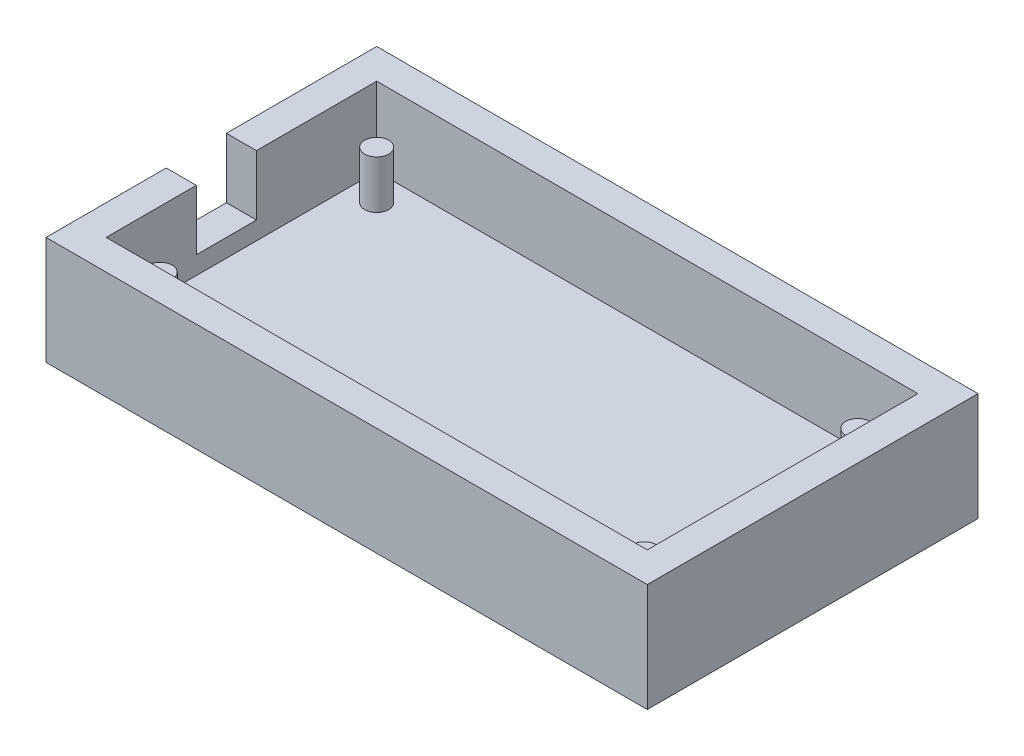
ISO-10303-21;
HEADER;
FILE_DESCRIPTION(('STEP AP214'),'2;1');
FILE_NAME('part.step','',(''),(''),'','','');
FILE_SCHEMA(('AUTOMOTIVE_DESIGN { 1 0 10303 214 1 1 1 1 }'));
ENDSEC;
DATA;
#1=APPLICATION_CONTEXT('core data for automotive mechanical design processes');
#2=APPLICATION_PROTOCOL_DEFINITION('international standard','automotive_design',2000,#1);
#3=PRODUCT_CONTEXT('',#1,'mechanical');
#4=PRODUCT('Part','Part','',(#3));
#5=PRODUCT_RELATED_PRODUCT_CATEGORY('part','',(#4));
#6=PRODUCT_DEFINITION_FORMATION('','',#4);
#7=PRODUCT_DEFINITION_CONTEXT('part definition',#1,'design');
#8=PRODUCT_DEFINITION('design','',#6,#7);
#9=PRODUCT_DEFINITION_SHAPE('','',#8);
#10=(LENGTH_UNIT() NAMED_UNIT(*) SI_UNIT(.MILLI.,.METRE.));
#11=(NAMED_UNIT(*) PLANE_ANGLE_UNIT() SI_UNIT($,.RADIAN.));
#12=(NAMED_UNIT(*) SI_UNIT($,.STERADIAN.) SOLID_ANGLE_UNIT());
#13=UNCERTAINTY_MEASURE_WITH_UNIT(LENGTH_MEASURE(1.E-05),#10,'distance_accuracy_value','');
#14=(GEOMETRIC_REPRESENTATION_CONTEXT(3) GLOBAL_UNCERTAINTY_ASSIGNED_CONTEXT((#13)) GLOBAL_UNIT_ASSIGNED_CONTEXT((#10,
#11,#12)) REPRESENTATION_CONTEXT('',''));
#15=CARTESIAN_POINT('',(0.,0.,0.));
#16=DIRECTION('',(0.,0.,1.));
#17=DIRECTION('',(1.,0.,0.));
#18=AXIS2_PLACEMENT_3D('',#15,#16,#17);
#19=CARTESIAN_POINT('',(0.,0.,0.));
#20=DIRECTION('',(0.,1.,0.));
#21=DIRECTION('',(0.,0.,1.));
#22=AXIS2_PLACEMENT_3D('',#19,#20,#21);
#23=PLANE('',#22);
#24=CARTESIAN_POINT('',(71.5420227764967,0.,-32.3069578450724));
#25=DIRECTION('',(0.,1.,0.));
#26=DIRECTION('',(0.,0.,1.));
#27=AXIS2_PLACEMENT_3D('',#24,#25,#26);
#28=CIRCLE('',#27,2.);
#29=CARTESIAN_POINT('',(71.5420227764967,0.,-30.3069578450724));
#30=VERTEX_POINT('',#29);
#31=EDGE_CURVE('E272',#30,#30,#28,.T.);
#32=ORIENTED_EDGE('',*,*,#31,.F.);
#33=EDGE_LOOP('',(#32));
#34=FACE_BOUND('',#33,.T.);
#35=CARTESIAN_POINT('',(71.5420227764967,0.,3.19304215492761));
#36=DIRECTION('',(0.,1.,0.));
#37=DIRECTION('',(0.,0.,1.));
#38=AXIS2_PLACEMENT_3D('',#35,#36,#37);
#39=CIRCLE('',#38,2.);
#40=CARTESIAN_POINT('',(71.5420227764967,0.,5.19304215492761));
#41=VERTEX_POINT('',#40);
#42=EDGE_CURVE('E266',#41,#41,#39,.T.);
#43=ORIENTED_EDGE('',*,*,#42,.F.);
#44=EDGE_LOOP('',(#43));
#45=FACE_BOUND('',#44,.T.);
#46=CARTESIAN_POINT('',(-8.95797722350329,0.,3.19304215492761));
#47=DIRECTION('',(0.,1.,0.));
#48=DIRECTION('',(0.,0.,1.));
#49=AXIS2_PLACEMENT_3D('',#46,#47,#48);
#50=CIRCLE('',#49,2.);
#51=CARTESIAN_POINT('',(-8.95797722350329,0.,5.19304215492761));
#52=VERTEX_POINT('',#51);
#53=EDGE_CURVE('E260',#52,#52,#50,.T.);
#54=ORIENTED_EDGE('',*,*,#53,.F.);
#55=EDGE_LOOP('',(#54));
#56=FACE_BOUND('',#55,.T.);
#57=CARTESIAN_POINT('',(-8.95797722350329,0.,-32.8069578450724));
#58=DIRECTION('',(0.,1.,0.));
#59=DIRECTION('',(0.,0.,1.));
#60=AXIS2_PLACEMENT_3D('',#57,#58,#59);
#61=CIRCLE('',#60,2.);
#62=CARTESIAN_POINT('',(-8.95797722350329,0.,-30.8069578450724));
#63=VERTEX_POINT('',#62);
#64=EDGE_CURVE('E254',#63,#63,#61,.T.);
#65=ORIENTED_EDGE('',*,*,#64,.F.);
#66=EDGE_LOOP('',(#65));
#67=FACE_BOUND('',#66,.T.);
#68=DIRECTION('',(0.,0.,-1.));
#69=VECTOR('',#68,1.);
#70=CARTESIAN_POINT('',(-13.4579772235033,0.,0.));
#71=LINE('',#70,#69);
#72=CARTESIAN_POINT('',(-13.4579772235033,0.,7.69304215492762));
#73=VERTEX_POINT('',#72);
#74=CARTESIAN_POINT('',(-13.4579772235033,0.,-37.3069578450724));
#75=VERTEX_POINT('',#74);
#76=EDGE_CURVE('E177',#73,#75,#71,.T.);
#77=ORIENTED_EDGE('',*,*,#76,.F.);
#78=DIRECTION('',(-1.,0.,0.));
#79=VECTOR('',#78,1.);
#80=CARTESIAN_POINT('',(0.,0.,7.69304215492762));
#81=LINE('',#80,#79);
#82=CARTESIAN_POINT('',(76.5420227764967,0.,7.69304215492761));
#83=VERTEX_POINT('',#82);
#84=EDGE_CURVE('E149',#83,#73,#81,.T.);
#85=ORIENTED_EDGE('',*,*,#84,.F.);
#86=DIRECTION('',(0.,0.,-1.));
#87=VECTOR('',#86,1.);
#88=CARTESIAN_POINT('',(76.5420227764967,0.,0.));
#89=LINE('',#88,#87);
#90=CARTESIAN_POINT('',(76.5420227764967,0.,-37.3069578450724));
#91=VERTEX_POINT('',#90);
#92=EDGE_CURVE('E152',#83,#91,#89,.T.);
#93=ORIENTED_EDGE('',*,*,#92,.T.);
#94=DIRECTION('',(-1.,0.,0.));
#95=VECTOR('',#94,1.);
#96=CARTESIAN_POINT('',(0.,0.,-37.3069578450724));
#97=LINE('',#96,#95);
#98=EDGE_CURVE('E180',#91,#75,#97,.T.);
#99=ORIENTED_EDGE('',*,*,#98,.T.);
#100=EDGE_LOOP('',(#77,#85,#93,#99));
#101=FACE_BOUND('',#100,.T.);
#102=ADVANCED_FACE('F38',(#34,#45,#56,#67,#101),#23,.T.);
#103=CARTESIAN_POINT('',(-18.4579772235033,-4.99999999999999,-42.3069578450724));
#104=DIRECTION('',(-1.,0.,0.));
#105=DIRECTION('',(0.,0.,1.));
#106=AXIS2_PLACEMENT_3D('',#103,#104,#105);
#107=PLANE('',#106);
#108=DIRECTION('',(0.,-1.,0.));
#109=VECTOR('',#108,1.);
#110=CARTESIAN_POINT('',(-18.4579772235033,13.,-7.30695784507238));
#111=LINE('',#110,#109);
#112=CARTESIAN_POINT('',(-18.4579772235033,13.,-7.30695784507238));
#113=VERTEX_POINT('',#112);
#114=CARTESIAN_POINT('',(-18.4579772235033,3.,-7.30695784507238));
#115=VERTEX_POINT('',#114);
#116=EDGE_CURVE('E127',#113,#115,#111,.T.);
#117=ORIENTED_EDGE('',*,*,#116,.T.);
#118=DIRECTION('',(0.,0.,1.));
#119=VECTOR('',#118,1.);
#120=CARTESIAN_POINT('',(-18.4579772235033,3.,0.));
#121=LINE('',#120,#119);
#122=CARTESIAN_POINT('',(-18.4579772235033,3.,-17.3069578450724));
#123=VERTEX_POINT('',#122);
#124=EDGE_CURVE('E225',#123,#115,#121,.T.);
#125=ORIENTED_EDGE('',*,*,#124,.F.);
#126=DIRECTION('',(0.,-1.,0.));
#127=VECTOR('',#126,1.);
#128=CARTESIAN_POINT('',(-18.4579772235033,13.,-17.3069578450724));
#129=LINE('',#128,#127);
#130=CARTESIAN_POINT('',(-18.4579772235033,13.,-17.3069578450724));
#131=VERTEX_POINT('',#130);
#132=EDGE_CURVE('E63',#131,#123,#129,.T.);
#133=ORIENTED_EDGE('',*,*,#132,.F.);
#134=DIRECTION('',(0.,0.,1.));
#135=VECTOR('',#134,1.);
#136=CARTESIAN_POINT('',(-18.4579772235033,13.,0.));
#137=LINE('',#136,#135);
#138=CARTESIAN_POINT('',(-18.4579772235033,13.,-42.3069578450724));
#139=VERTEX_POINT('',#138);
#140=EDGE_CURVE('E144',#139,#131,#137,.T.);
#141=ORIENTED_EDGE('',*,*,#140,.F.);
#142=DIRECTION('',(0.,1.,0.));
#143=VECTOR('',#142,1.);
#144=CARTESIAN_POINT('',(-18.4579772235033,-4.99999999999999,-42.3069578450724));
#145=LINE('',#144,#143);
#146=CARTESIAN_POINT('',(-18.4579772235033,-4.99999999999999,-42.3069578450724));
#147=VERTEX_POINT('',#146);
#148=EDGE_CURVE('E11',#147,#139,#145,.T.);
#149=ORIENTED_EDGE('',*,*,#148,.F.);
#150=DIRECTION('',(0.,0.,1.));
#151=VECTOR('',#150,1.);
#152=CARTESIAN_POINT('',(-18.4579772235033,-4.99999999999999,-42.3069578450724));
#153=LINE('',#152,#151);
#154=CARTESIAN_POINT('',(-18.4579772235033,-4.99999999999999,12.6930421369276));
#155=VERTEX_POINT('',#154);
#156=EDGE_CURVE('E134',#147,#155,#153,.T.);
#157=ORIENTED_EDGE('',*,*,#156,.T.);
#158=DIRECTION('',(0.,1.,0.));
#159=VECTOR('',#158,1.);
#160=CARTESIAN_POINT('',(-18.4579772235033,-4.99999999999999,12.6930421369276));
#161=LINE('',#160,#159);
#162=CARTESIAN_POINT('',(-18.4579772235033,13.,12.6930421369276));
#163=VERTEX_POINT('',#162);
#164=EDGE_CURVE('E42',#155,#163,#161,.T.);
#165=ORIENTED_EDGE('',*,*,#164,.T.);
#166=EDGE_CURVE('E137',#113,#163,#137,.T.);
#167=ORIENTED_EDGE('',*,*,#166,.F.);
#168=EDGE_LOOP('',(#117,#125,#133,#141,#149,#157,#165,#167));
#169=FACE_BOUND('',#168,.T.);
#170=ADVANCED_FACE('F40',(#169),#107,.T.);
#171=CARTESIAN_POINT('',(-18.4579772235033,-4.99999999999999,-42.3069578450724));
#172=DIRECTION('',(0.,0.,-1.));
#173=DIRECTION('',(-1.,0.,0.));
#174=AXIS2_PLACEMENT_3D('',#171,#172,#173);
#175=PLANE('',#174);
#176=ORIENTED_EDGE('',*,*,#148,.T.);
#177=DIRECTION('',(-1.,0.,0.));
#178=VECTOR('',#177,1.);
#179=CARTESIAN_POINT('',(0.,13.,-42.3069578450724));
#180=LINE('',#179,#178);
#181=CARTESIAN_POINT('',(81.5420226744967,13.,-42.3069578450724));
#182=VERTEX_POINT('',#181);
#183=EDGE_CURVE('E162',#182,#139,#180,.T.);
#184=ORIENTED_EDGE('',*,*,#183,.F.);
#185=DIRECTION('',(0.,1.,0.));
#186=VECTOR('',#185,1.);
#187=CARTESIAN_POINT('',(81.5420226744967,-4.99999999999999,-42.3069578450724));
#188=LINE('',#187,#186);
#189=CARTESIAN_POINT('',(81.5420226744967,-4.99999999999999,-42.3069578450724));
#190=VERTEX_POINT('',#189);
#191=EDGE_CURVE('E47',#190,#182,#188,.T.);
#192=ORIENTED_EDGE('',*,*,#191,.F.);
#193=DIRECTION('',(-1.,0.,0.));
#194=VECTOR('',#193,1.);
#195=CARTESIAN_POINT('',(-18.4579772235033,-4.99999999999999,-42.3069578450724));
#196=LINE('',#195,#194);
#197=EDGE_CURVE('E208',#190,#147,#196,.T.);
#198=ORIENTED_EDGE('',*,*,#197,.T.);
#199=EDGE_LOOP('',(#176,#184,#192,#198));
#200=FACE_BOUND('',#199,.T.);
#201=ADVANCED_FACE('F222',(#200),#175,.T.);
#202=CARTESIAN_POINT('',(81.5420226744967,-4.99999999999999,-42.3069578450724));
#203=DIRECTION('',(1.,0.,0.));
#204=DIRECTION('',(0.,0.,-1.));
#205=AXIS2_PLACEMENT_3D('',#202,#203,#204);
#206=PLANE('',#205);
#207=ORIENTED_EDGE('',*,*,#191,.T.);
#208=DIRECTION('',(0.,0.,-1.));
#209=VECTOR('',#208,1.);
#210=CARTESIAN_POINT('',(81.5420226744967,13.,0.));
#211=LINE('',#210,#209);
#212=CARTESIAN_POINT('',(81.5420226744967,13.,12.6930421369276));
#213=VERTEX_POINT('',#212);
#214=EDGE_CURVE('E159',#213,#182,#211,.T.);
#215=ORIENTED_EDGE('',*,*,#214,.F.);
#216=DIRECTION('',(0.,1.,0.));
#217=VECTOR('',#216,1.);
#218=CARTESIAN_POINT('',(81.5420226744967,-4.99999999999999,12.6930421369276));
#219=LINE('',#218,#217);
#220=CARTESIAN_POINT('',(81.5420226744967,-4.99999999999999,12.6930421369276));
#221=VERTEX_POINT('',#220);
#222=EDGE_CURVE('E211',#221,#213,#219,.T.);
#223=ORIENTED_EDGE('',*,*,#222,.F.);
#224=DIRECTION('',(0.,0.,-1.));
#225=VECTOR('',#224,1.);
#226=CARTESIAN_POINT('',(81.5420226744967,-4.99999999999999,-42.3069578450724));
#227=LINE('',#226,#225);
#228=EDGE_CURVE('E205',#221,#190,#227,.T.);
#229=ORIENTED_EDGE('',*,*,#228,.T.);
#230=EDGE_LOOP('',(#207,#215,#223,#229));
#231=FACE_BOUND('',#230,.T.);
#232=ADVANCED_FACE('F219',(#231),#206,.T.);
#233=CARTESIAN_POINT('',(-18.4579772235033,-4.99999999999999,12.6930421369276));
#234=DIRECTION('',(0.,0.,1.));
#235=DIRECTION('',(1.,0.,0.));
#236=AXIS2_PLACEMENT_3D('',#233,#234,#235);
#237=PLANE('',#236);
#238=ORIENTED_EDGE('',*,*,#222,.T.);
#239=DIRECTION('',(1.,0.,0.));
#240=VECTOR('',#239,1.);
#241=CARTESIAN_POINT('',(0.,13.,12.6930421369276));
#242=LINE('',#241,#240);
#243=EDGE_CURVE('E142',#163,#213,#242,.T.);
#244=ORIENTED_EDGE('',*,*,#243,.F.);
#245=ORIENTED_EDGE('',*,*,#164,.F.);
#246=DIRECTION('',(1.,0.,0.));
#247=VECTOR('',#246,1.);
#248=CARTESIAN_POINT('',(-18.4579772235033,-4.99999999999999,12.6930421369276));
#249=LINE('',#248,#247);
#250=EDGE_CURVE('E202',#155,#221,#249,.T.);
#251=ORIENTED_EDGE('',*,*,#250,.T.);
#252=EDGE_LOOP('',(#238,#244,#245,#251));
#253=FACE_BOUND('',#252,.T.);
#254=ADVANCED_FACE('F213',(#253),#237,.T.);
#255=CARTESIAN_POINT('',(0.,-4.99999999999999,0.));
#256=DIRECTION('',(0.,1.,0.));
#257=DIRECTION('',(0.,0.,1.));
#258=AXIS2_PLACEMENT_3D('',#255,#256,#257);
#259=PLANE('',#258);
#260=ORIENTED_EDGE('',*,*,#156,.F.);
#261=ORIENTED_EDGE('',*,*,#197,.F.);
#262=ORIENTED_EDGE('',*,*,#228,.F.);
#263=ORIENTED_EDGE('',*,*,#250,.F.);
#264=EDGE_LOOP('',(#260,#261,#262,#263));
#265=FACE_BOUND('',#264,.T.);
#266=ADVANCED_FACE('F327',(#265),#259,.F.);
#267=CARTESIAN_POINT('',(0.,13.,-7.30695784507238));
#268=DIRECTION('',(0.,0.,-1.));
#269=DIRECTION('',(-1.,0.,0.));
#270=AXIS2_PLACEMENT_3D('',#267,#268,#269);
#271=PLANE('',#270);
#272=DIRECTION('',(1.,0.,0.));
#273=VECTOR('',#272,1.);
#274=CARTESIAN_POINT('',(0.,3.,-7.30695784507238));
#275=LINE('',#274,#273);
#276=CARTESIAN_POINT('',(-13.4579772235033,3.,-7.30695784507238));
#277=VERTEX_POINT('',#276);
#278=EDGE_CURVE('E55',#115,#277,#275,.T.);
#279=ORIENTED_EDGE('',*,*,#278,.F.);
#280=ORIENTED_EDGE('',*,*,#116,.F.);
#281=DIRECTION('',(1.,0.,0.));
#282=VECTOR('',#281,1.);
#283=CARTESIAN_POINT('',(0.,13.,-7.30695784507238));
#284=LINE('',#283,#282);
#285=CARTESIAN_POINT('',(-13.4579772235033,13.,-7.30695784507238));
#286=VERTEX_POINT('',#285);
#287=EDGE_CURVE('E131',#113,#286,#284,.T.);
#288=ORIENTED_EDGE('',*,*,#287,.T.);
#289=DIRECTION('',(0.,-1.,0.));
#290=VECTOR('',#289,1.);
#291=CARTESIAN_POINT('',(-13.4579772235033,13.,-7.30695784507238));
#292=LINE('',#291,#290);
#293=EDGE_CURVE('E183',#286,#277,#292,.T.);
#294=ORIENTED_EDGE('',*,*,#293,.T.);
#295=EDGE_LOOP('',(#279,#280,#288,#294));
#296=FACE_BOUND('',#295,.T.);
#297=ADVANCED_FACE('F129',(#296),#271,.T.);
#298=CARTESIAN_POINT('',(0.,13.,-17.3069578450724));
#299=DIRECTION('',(0.,0.,-1.));
#300=DIRECTION('',(-1.,0.,0.));
#301=AXIS2_PLACEMENT_3D('',#298,#299,#300);
#302=PLANE('',#301);
#303=ORIENTED_EDGE('',*,*,#132,.T.);
#304=DIRECTION('',(1.,0.,0.));
#305=VECTOR('',#304,1.);
#306=CARTESIAN_POINT('',(0.,3.,-17.3069578450724));
#307=LINE('',#306,#305);
#308=CARTESIAN_POINT('',(-13.4579772235033,3.,-17.3069578450724));
#309=VERTEX_POINT('',#308);
#310=EDGE_CURVE('E155',#123,#309,#307,.T.);
#311=ORIENTED_EDGE('',*,*,#310,.T.);
#312=DIRECTION('',(0.,-1.,0.));
#313=VECTOR('',#312,1.);
#314=CARTESIAN_POINT('',(-13.4579772235033,13.,-17.3069578450724));
#315=LINE('',#314,#313);
#316=CARTESIAN_POINT('',(-13.4579772235033,13.,-17.3069578450724));
#317=VERTEX_POINT('',#316);
#318=EDGE_CURVE('E197',#317,#309,#315,.T.);
#319=ORIENTED_EDGE('',*,*,#318,.F.);
#320=DIRECTION('',(1.,0.,0.));
#321=VECTOR('',#320,1.);
#322=CARTESIAN_POINT('',(0.,13.,-17.3069578450724));
#323=LINE('',#322,#321);
#324=EDGE_CURVE('E165',#131,#317,#323,.T.);
#325=ORIENTED_EDGE('',*,*,#324,.F.);
#326=EDGE_LOOP('',(#303,#311,#319,#325));
#327=FACE_BOUND('',#326,.T.);
#328=ADVANCED_FACE('F228',(#327),#302,.F.);
#329=CARTESIAN_POINT('',(-13.4579772235033,13.,0.));
#330=DIRECTION('',(-1.,0.,0.));
#331=DIRECTION('',(0.,0.,1.));
#332=AXIS2_PLACEMENT_3D('',#329,#330,#331);
#333=PLANE('',#332);
#334=ORIENTED_EDGE('',*,*,#76,.T.);
#335=DIRECTION('',(0.,-1.,0.));
#336=VECTOR('',#335,1.);
#337=CARTESIAN_POINT('',(-13.4579772235033,13.,-37.3069578450724));
#338=LINE('',#337,#336);
#339=CARTESIAN_POINT('',(-13.4579772235033,13.,-37.3069578450724));
#340=VERTEX_POINT('',#339);
#341=EDGE_CURVE('E194',#340,#75,#338,.T.);
#342=ORIENTED_EDGE('',*,*,#341,.F.);
#343=DIRECTION('',(0.,0.,-1.));
#344=VECTOR('',#343,1.);
#345=CARTESIAN_POINT('',(-13.4579772235033,13.,0.));
#346=LINE('',#345,#344);
#347=EDGE_CURVE('E167',#317,#340,#346,.T.);
#348=ORIENTED_EDGE('',*,*,#347,.F.);
#349=ORIENTED_EDGE('',*,*,#318,.T.);
#350=DIRECTION('',(0.,0.,-1.));
#351=VECTOR('',#350,1.);
#352=CARTESIAN_POINT('',(-13.4579772235033,3.,0.));
#353=LINE('',#352,#351);
#354=EDGE_CURVE('E247',#277,#309,#353,.T.);
#355=ORIENTED_EDGE('',*,*,#354,.F.);
#356=ORIENTED_EDGE('',*,*,#293,.F.);
#357=CARTESIAN_POINT('',(-13.4579772235033,13.,7.69304215492762));
#358=VERTEX_POINT('',#357);
#359=EDGE_CURVE('E147',#358,#286,#346,.T.);
#360=ORIENTED_EDGE('',*,*,#359,.F.);
#361=DIRECTION('',(0.,-1.,0.));
#362=VECTOR('',#361,1.);
#363=CARTESIAN_POINT('',(-13.4579772235033,13.,7.69304215492762));
#364=LINE('',#363,#362);
#365=EDGE_CURVE('E185',#358,#73,#364,.T.);
#366=ORIENTED_EDGE('',*,*,#365,.T.);
#367=EDGE_LOOP('',(#334,#342,#348,#349,#355,#356,#360,#366));
#368=FACE_BOUND('',#367,.T.);
#369=ADVANCED_FACE('F234',(#368),#333,.F.);
#370=CARTESIAN_POINT('',(0.,13.,-37.3069578450724));
#371=DIRECTION('',(0.,0.,1.));
#372=DIRECTION('',(1.,0.,0.));
#373=AXIS2_PLACEMENT_3D('',#370,#371,#372);
#374=PLANE('',#373);
#375=ORIENTED_EDGE('',*,*,#98,.F.);
#376=DIRECTION('',(0.,-1.,0.));
#377=VECTOR('',#376,1.);
#378=CARTESIAN_POINT('',(76.5420227764967,13.,-37.3069578450724));
#379=LINE('',#378,#377);
#380=CARTESIAN_POINT('',(76.5420227764967,13.,-37.3069578450724));
#381=VERTEX_POINT('',#380);
#382=EDGE_CURVE('E191',#381,#91,#379,.T.);
#383=ORIENTED_EDGE('',*,*,#382,.F.);
#384=DIRECTION('',(-1.,0.,0.));
#385=VECTOR('',#384,1.);
#386=CARTESIAN_POINT('',(0.,13.,-37.3069578450724));
#387=LINE('',#386,#385);
#388=EDGE_CURVE('E169',#381,#340,#387,.T.);
#389=ORIENTED_EDGE('',*,*,#388,.T.);
#390=ORIENTED_EDGE('',*,*,#341,.T.);
#391=EDGE_LOOP('',(#375,#383,#389,#390));
#392=FACE_BOUND('',#391,.T.);
#393=ADVANCED_FACE('F237',(#392),#374,.T.);
#394=CARTESIAN_POINT('',(76.5420227764967,13.,0.));
#395=DIRECTION('',(-1.,0.,0.));
#396=DIRECTION('',(0.,0.,1.));
#397=AXIS2_PLACEMENT_3D('',#394,#395,#396);
#398=PLANE('',#397);
#399=ORIENTED_EDGE('',*,*,#92,.F.);
#400=DIRECTION('',(0.,-1.,0.));
#401=VECTOR('',#400,1.);
#402=CARTESIAN_POINT('',(76.5420227764967,13.,7.69304215492761));
#403=LINE('',#402,#401);
#404=CARTESIAN_POINT('',(76.5420227764967,13.,7.69304215492761));
#405=VERTEX_POINT('',#404);
#406=EDGE_CURVE('E188',#405,#83,#403,.T.);
#407=ORIENTED_EDGE('',*,*,#406,.F.);
#408=DIRECTION('',(0.,0.,-1.));
#409=VECTOR('',#408,1.);
#410=CARTESIAN_POINT('',(76.5420227764967,13.,0.));
#411=LINE('',#410,#409);
#412=EDGE_CURVE('E172',#405,#381,#411,.T.);
#413=ORIENTED_EDGE('',*,*,#412,.T.);
#414=ORIENTED_EDGE('',*,*,#382,.T.);
#415=EDGE_LOOP('',(#399,#407,#413,#414));
#416=FACE_BOUND('',#415,.T.);
#417=ADVANCED_FACE('F240',(#416),#398,.T.);
#418=CARTESIAN_POINT('',(0.,13.,7.69304215492762));
#419=DIRECTION('',(0.,0.,1.));
#420=DIRECTION('',(1.,0.,0.));
#421=AXIS2_PLACEMENT_3D('',#418,#419,#420);
#422=PLANE('',#421);
#423=ORIENTED_EDGE('',*,*,#84,.T.);
#424=ORIENTED_EDGE('',*,*,#365,.F.);
#425=DIRECTION('',(-1.,0.,0.));
#426=VECTOR('',#425,1.);
#427=CARTESIAN_POINT('',(0.,13.,7.69304215492762));
#428=LINE('',#427,#426);
#429=EDGE_CURVE('E175',#405,#358,#428,.T.);
#430=ORIENTED_EDGE('',*,*,#429,.F.);
#431=ORIENTED_EDGE('',*,*,#406,.T.);
#432=EDGE_LOOP('',(#423,#424,#430,#431));
#433=FACE_BOUND('',#432,.T.);
#434=ADVANCED_FACE('F244',(#433),#422,.F.);
#435=CARTESIAN_POINT('',(0.,13.,0.));
#436=DIRECTION('',(0.,1.,0.));
#437=DIRECTION('',(0.,0.,1.));
#438=AXIS2_PLACEMENT_3D('',#435,#436,#437);
#439=PLANE('',#438);
#440=ORIENTED_EDGE('',*,*,#287,.F.);
#441=ORIENTED_EDGE('',*,*,#166,.T.);
#442=ORIENTED_EDGE('',*,*,#243,.T.);
#443=ORIENTED_EDGE('',*,*,#214,.T.);
#444=ORIENTED_EDGE('',*,*,#183,.T.);
#445=ORIENTED_EDGE('',*,*,#140,.T.);
#446=ORIENTED_EDGE('',*,*,#324,.T.);
#447=ORIENTED_EDGE('',*,*,#347,.T.);
#448=ORIENTED_EDGE('',*,*,#388,.F.);
#449=ORIENTED_EDGE('',*,*,#412,.F.);
#450=ORIENTED_EDGE('',*,*,#429,.T.);
#451=ORIENTED_EDGE('',*,*,#359,.T.);
#452=EDGE_LOOP('',(#440,#441,#442,#443,#444,#445,#446,#447,#448,#449,#450,#451));
#453=FACE_BOUND('',#452,.T.);
#454=ADVANCED_FACE('F145',(#453),#439,.T.);
#455=CARTESIAN_POINT('',(0.,3.,0.));
#456=DIRECTION('',(0.,1.,0.));
#457=DIRECTION('',(0.,0.,1.));
#458=AXIS2_PLACEMENT_3D('',#455,#456,#457);
#459=PLANE('',#458);
#460=ORIENTED_EDGE('',*,*,#124,.T.);
#461=ORIENTED_EDGE('',*,*,#278,.T.);
#462=ORIENTED_EDGE('',*,*,#354,.T.);
#463=ORIENTED_EDGE('',*,*,#310,.F.);
#464=EDGE_LOOP('',(#460,#461,#462,#463));
#465=FACE_BOUND('',#464,.T.);
#466=ADVANCED_FACE('F249',(#465),#459,.T.);
#467=CARTESIAN_POINT('',(-8.95797722350329,8.,-32.8069578450724));
#468=DIRECTION('',(0.,-1.,0.));
#469=DIRECTION('',(0.,0.,-1.));
#470=AXIS2_PLACEMENT_3D('',#467,#468,#469);
#471=CYLINDRICAL_SURFACE('',#470,2.);
#472=CARTESIAN_POINT('',(-8.95797722350329,8.,-32.8069578450724));
#473=DIRECTION('',(0.,1.,0.));
#474=DIRECTION('',(0.,0.,1.));
#475=AXIS2_PLACEMENT_3D('',#472,#473,#474);
#476=CIRCLE('',#475,2.);
#477=CARTESIAN_POINT('',(-8.95797722350329,8.,-30.8069578450724));
#478=VERTEX_POINT('',#477);
#479=EDGE_CURVE('E251',#478,#478,#476,.T.);
#480=ORIENTED_EDGE('',*,*,#479,.F.);
#481=EDGE_LOOP('',(#480));
#482=FACE_BOUND('',#481,.T.);
#483=ORIENTED_EDGE('',*,*,#64,.T.);
#484=EDGE_LOOP('',(#483));
#485=FACE_BOUND('',#484,.T.);
#486=ADVANCED_FACE('F297',(#482,#485),#471,.T.);
#487=CARTESIAN_POINT('',(-8.95797722350329,8.,-32.8069578450724));
#488=DIRECTION('',(0.,1.,0.));
#489=DIRECTION('',(0.,0.,1.));
#490=AXIS2_PLACEMENT_3D('',#487,#488,#489);
#491=PLANE('',#490);
#492=ORIENTED_EDGE('',*,*,#479,.T.);
#493=EDGE_LOOP('',(#492));
#494=FACE_BOUND('',#493,.T.);
#495=ADVANCED_FACE('F299',(#494),#491,.T.);
#496=CARTESIAN_POINT('',(-8.95797722350329,8.,3.19304215492761));
#497=DIRECTION('',(0.,-1.,0.));
#498=DIRECTION('',(0.,0.,-1.));
#499=AXIS2_PLACEMENT_3D('',#496,#497,#498);
#500=CYLINDRICAL_SURFACE('',#499,2.);
#501=CARTESIAN_POINT('',(-8.95797722350329,8.,3.19304215492761));
#502=DIRECTION('',(0.,1.,0.));
#503=DIRECTION('',(0.,0.,1.));
#504=AXIS2_PLACEMENT_3D('',#501,#502,#503);
#505=CIRCLE('',#504,2.);
#506=CARTESIAN_POINT('',(-8.95797722350329,8.,5.19304215492761));
#507=VERTEX_POINT('',#506);
#508=EDGE_CURVE('E257',#507,#507,#505,.T.);
#509=ORIENTED_EDGE('',*,*,#508,.F.);
#510=EDGE_LOOP('',(#509));
#511=FACE_BOUND('',#510,.T.);
#512=ORIENTED_EDGE('',*,*,#53,.T.);
#513=EDGE_LOOP('',(#512));
#514=FACE_BOUND('',#513,.T.);
#515=ADVANCED_FACE('F306',(#511,#514),#500,.T.);
#516=CARTESIAN_POINT('',(-8.95797722350329,8.,3.19304215492761));
#517=DIRECTION('',(0.,1.,0.));
#518=DIRECTION('',(0.,0.,1.));
#519=AXIS2_PLACEMENT_3D('',#516,#517,#518);
#520=PLANE('',#519);
#521=ORIENTED_EDGE('',*,*,#508,.T.);
#522=EDGE_LOOP('',(#521));
#523=FACE_BOUND('',#522,.T.);
#524=ADVANCED_FACE('F404',(#523),#520,.T.);
#525=CARTESIAN_POINT('',(71.5420227764967,8.,3.19304215492761));
#526=DIRECTION('',(0.,-1.,0.));
#527=DIRECTION('',(0.,0.,-1.));
#528=AXIS2_PLACEMENT_3D('',#525,#526,#527);
#529=CYLINDRICAL_SURFACE('',#528,2.);
#530=CARTESIAN_POINT('',(71.5420227764967,8.,3.19304215492761));
#531=DIRECTION('',(0.,1.,0.));
#532=DIRECTION('',(0.,0.,1.));
#533=AXIS2_PLACEMENT_3D('',#530,#531,#532);
#534=CIRCLE('',#533,2.);
#535=CARTESIAN_POINT('',(71.5420227764967,8.,5.19304215492761));
#536=VERTEX_POINT('',#535);
#537=EDGE_CURVE('E263',#536,#536,#534,.T.);
#538=ORIENTED_EDGE('',*,*,#537,.F.);
#539=EDGE_LOOP('',(#538));
#540=FACE_BOUND('',#539,.T.);
#541=ORIENTED_EDGE('',*,*,#42,.T.);
#542=EDGE_LOOP('',(#541));
#543=FACE_BOUND('',#542,.T.);
#544=ADVANCED_FACE('F413',(#540,#543),#529,.T.);
#545=CARTESIAN_POINT('',(71.5420227764967,8.,3.19304215492761));
#546=DIRECTION('',(0.,1.,0.));
#547=DIRECTION('',(0.,0.,1.));
#548=AXIS2_PLACEMENT_3D('',#545,#546,#547);
#549=PLANE('',#548);
#550=ORIENTED_EDGE('',*,*,#537,.T.);
#551=EDGE_LOOP('',(#550));
#552=FACE_BOUND('',#551,.T.);
#553=ADVANCED_FACE('F283',(#552),#549,.T.);
#554=CARTESIAN_POINT('',(71.5420227764967,8.,-32.3069578450724));
#555=DIRECTION('',(0.,-1.,0.));
#556=DIRECTION('',(0.,0.,-1.));
#557=AXIS2_PLACEMENT_3D('',#554,#555,#556);
#558=CYLINDRICAL_SURFACE('',#557,2.);
#559=CARTESIAN_POINT('',(71.5420227764967,8.,-32.3069578450724));
#560=DIRECTION('',(0.,1.,0.));
#561=DIRECTION('',(0.,0.,1.));
#562=AXIS2_PLACEMENT_3D('',#559,#560,#561);
#563=CIRCLE('',#562,2.);
#564=CARTESIAN_POINT('',(71.5420227764967,8.,-30.3069578450724));
#565=VERTEX_POINT('',#564);
#566=EDGE_CURVE('E269',#565,#565,#563,.T.);
#567=ORIENTED_EDGE('',*,*,#566,.F.);
#568=EDGE_LOOP('',(#567));
#569=FACE_BOUND('',#568,.T.);
#570=ORIENTED_EDGE('',*,*,#31,.T.);
#571=EDGE_LOOP('',(#570));
#572=FACE_BOUND('',#571,.T.);
#573=ADVANCED_FACE('F280',(#569,#572),#558,.T.);
#574=CARTESIAN_POINT('',(71.5420227764967,8.,-32.3069578450724));
#575=DIRECTION('',(0.,1.,0.));
#576=DIRECTION('',(0.,0.,1.));
#577=AXIS2_PLACEMENT_3D('',#574,#575,#576);
#578=PLANE('',#577);
#579=ORIENTED_EDGE('',*,*,#566,.T.);
#580=EDGE_LOOP('',(#579));
#581=FACE_BOUND('',#580,.T.);
#582=ADVANCED_FACE('F278',(#581),#578,.T.);
#583=CLOSED_SHELL('',(#102,#170,#201,#232,#254,#266,#297,#328,#369,#393,#417,#434,#454,#466,
#486,#495,#515,#524,#544,#553,#573,#582));
#584=MANIFOLD_SOLID_BREP('B2',#583);
#585=ADVANCED_BREP_SHAPE_REPRESENTATION('',(#18,#584),#14);
#586=SHAPE_DEFINITION_REPRESENTATION(#9,#585);
ENDSEC;
END-ISO-10303-21;
